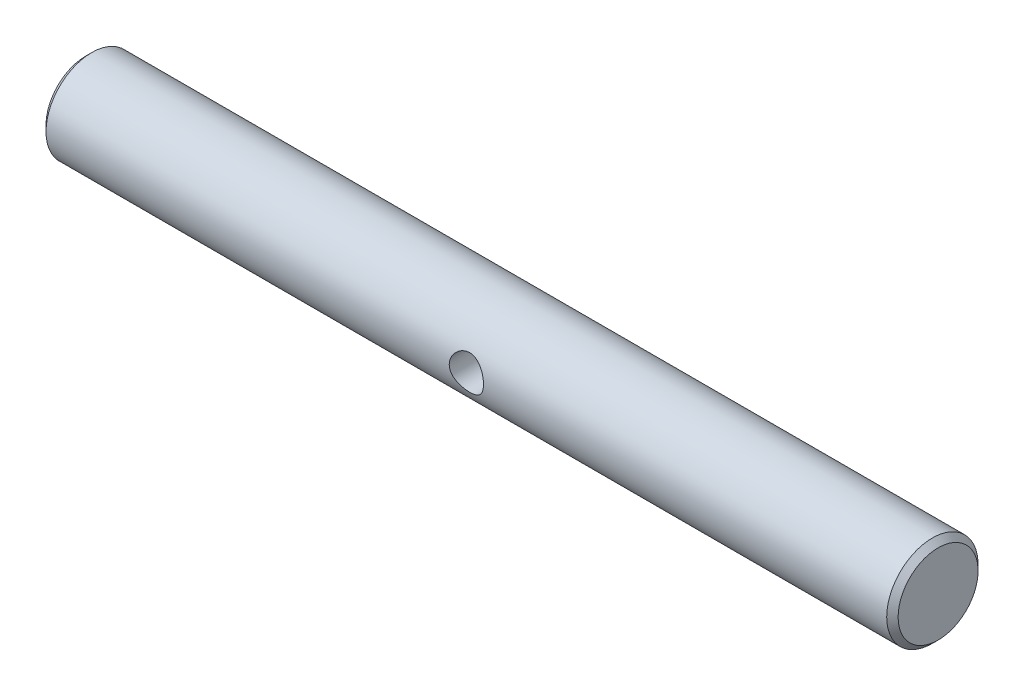
ISO-10303-21;
HEADER;
FILE_DESCRIPTION(('STEP AP214'),'2;1');
FILE_NAME('part.step','',(''),(''),'','','');
FILE_SCHEMA(('AUTOMOTIVE_DESIGN { 1 0 10303 214 1 1 1 1 }'));
ENDSEC;
DATA;
#1=APPLICATION_CONTEXT('core data for automotive mechanical design processes');
#2=APPLICATION_PROTOCOL_DEFINITION('international standard','automotive_design',2000,#1);
#3=PRODUCT_CONTEXT('',#1,'mechanical');
#4=PRODUCT('Part','Part','',(#3));
#5=PRODUCT_RELATED_PRODUCT_CATEGORY('part','',(#4));
#6=PRODUCT_DEFINITION_FORMATION('','',#4);
#7=PRODUCT_DEFINITION_CONTEXT('part definition',#1,'design');
#8=PRODUCT_DEFINITION('design','',#6,#7);
#9=PRODUCT_DEFINITION_SHAPE('','',#8);
#10=(LENGTH_UNIT() NAMED_UNIT(*) SI_UNIT(.MILLI.,.METRE.));
#11=(NAMED_UNIT(*) PLANE_ANGLE_UNIT() SI_UNIT($,.RADIAN.));
#12=(NAMED_UNIT(*) SI_UNIT($,.STERADIAN.) SOLID_ANGLE_UNIT());
#13=UNCERTAINTY_MEASURE_WITH_UNIT(LENGTH_MEASURE(1.E-05),#10,'distance_accuracy_value','');
#14=(GEOMETRIC_REPRESENTATION_CONTEXT(3) GLOBAL_UNCERTAINTY_ASSIGNED_CONTEXT((#13)) GLOBAL_UNIT_ASSIGNED_CONTEXT((#10,
#11,#12)) REPRESENTATION_CONTEXT('',''));
#15=CARTESIAN_POINT('',(0.,0.,0.));
#16=DIRECTION('',(0.,0.,1.));
#17=DIRECTION('',(1.,0.,0.));
#18=AXIS2_PLACEMENT_3D('',#15,#16,#17);
#19=CARTESIAN_POINT('',(37.3,0.,-7.5));
#20=DIRECTION('',(-1.,0.,0.));
#21=DIRECTION('',(0.,0.,1.));
#22=AXIS2_PLACEMENT_3D('',#19,#20,#21);
#23=PLANE('',#22);
#24=CARTESIAN_POINT('',(37.3000000000729,0.,-7.5));
#25=DIRECTION('',(-1.,0.,0.));
#26=DIRECTION('',(0.,0.,1.));
#27=AXIS2_PLACEMENT_3D('',#24,#25,#26);
#28=CIRCLE('',#27,3.50000000003774);
#29=CARTESIAN_POINT('',(37.3000000000729,0.,-3.99999999996226));
#30=VERTEX_POINT('',#29);
#31=EDGE_CURVE('E20',#30,#30,#28,.T.);
#32=ORIENTED_EDGE('',*,*,#31,.F.);
#33=EDGE_LOOP('',(#32));
#34=FACE_BOUND('',#33,.T.);
#35=ADVANCED_FACE('F17',(#34),#23,.F.);
#36=CARTESIAN_POINT('',(-37.3,0.,-7.5));
#37=DIRECTION('',(1.,0.,0.));
#38=DIRECTION('',(0.,0.,-1.));
#39=AXIS2_PLACEMENT_3D('',#36,#37,#38);
#40=PLANE('',#39);
#41=CARTESIAN_POINT('',(-37.3000000000161,0.,-7.5));
#42=DIRECTION('',(1.,0.,0.));
#43=DIRECTION('',(0.,0.,-1.));
#44=AXIS2_PLACEMENT_3D('',#41,#42,#43);
#45=CIRCLE('',#44,3.49999999996726);
#46=CARTESIAN_POINT('',(-37.3000000000161,0.,-10.9999999999673));
#47=VERTEX_POINT('',#46);
#48=EDGE_CURVE('E102',#47,#47,#45,.T.);
#49=ORIENTED_EDGE('',*,*,#48,.F.);
#50=EDGE_LOOP('',(#49));
#51=FACE_BOUND('',#50,.T.);
#52=ADVANCED_FACE('F113',(#51),#40,.F.);
#53=CARTESIAN_POINT('',(36.8000000000279,0.,-7.5));
#54=DIRECTION('',(-1.,0.,0.));
#55=DIRECTION('',(0.,0.,1.));
#56=AXIS2_PLACEMENT_3D('',#53,#54,#55);
#57=CONICAL_SURFACE('',#56,4.00000000002592,0.785398163340605);
#58=ORIENTED_EDGE('',*,*,#31,.T.);
#59=EDGE_LOOP('',(#58));
#60=FACE_BOUND('',#59,.T.);
#61=CARTESIAN_POINT('',(36.8,0.,-7.5));
#62=DIRECTION('',(-1.,0.,0.));
#63=DIRECTION('',(0.,0.,1.));
#64=AXIS2_PLACEMENT_3D('',#61,#62,#63);
#65=CIRCLE('',#64,4.);
#66=CARTESIAN_POINT('',(36.8,0.,-3.5));
#67=VERTEX_POINT('',#66);
#68=EDGE_CURVE('E59',#67,#67,#65,.T.);
#69=ORIENTED_EDGE('',*,*,#68,.F.);
#70=EDGE_LOOP('',(#69));
#71=FACE_BOUND('',#70,.T.);
#72=ADVANCED_FACE('F97',(#60,#71),#57,.T.);
#73=CARTESIAN_POINT('',(0.,0.,19.6475180106472));
#74=DIRECTION('',(0.,0.,-1.));
#75=DIRECTION('',(-1.,0.,0.));
#76=AXIS2_PLACEMENT_3D('',#73,#74,#75);
#77=CYLINDRICAL_SURFACE('',#76,1.5);
#78=CARTESIAN_POINT('',(0.,0.,-11.));
#79=DIRECTION('',(0.,0.,-1.));
#80=DIRECTION('',(-1.,0.,0.));
#81=AXIS2_PLACEMENT_3D('',#78,#79,#80);
#82=CIRCLE('',#81,1.5);
#83=CARTESIAN_POINT('',(-1.5,0.,-11.));
#84=VERTEX_POINT('',#83);
#85=EDGE_CURVE('E54',#84,#84,#82,.T.);
#86=ORIENTED_EDGE('',*,*,#85,.T.);
#87=EDGE_LOOP('',(#86));
#88=FACE_BOUND('',#87,.T.);
#89=CARTESIAN_POINT('',(1.5,0.,-3.5));
#90=CARTESIAN_POINT('',(1.49999531099465,-0.0811116429884713,-3.50000358485876));
#91=CARTESIAN_POINT('',(1.49338938745138,-0.16229921963897,-3.50249349886293));
#92=CARTESIAN_POINT('',(1.46720660039424,-0.322336155858779,-3.51219945479501));
#93=CARTESIAN_POINT('',(1.44760993379607,-0.401181753294325,-3.51942271203636));
#94=CARTESIAN_POINT('',(1.39624231347491,-0.554069232231289,-3.5378135631584));
#95=CARTESIAN_POINT('',(1.36450309579201,-0.628123052651569,-3.54897086901631));
#96=CARTESIAN_POINT('',(1.28987991906231,-0.769822157276449,-3.57411671625291));
#97=CARTESIAN_POINT('',(1.24699654962911,-0.837467780266993,-3.58810510783615));
#98=CARTESIAN_POINT('',(1.14938858838142,-0.96734457210255,-3.61813720475945));
#99=CARTESIAN_POINT('',(1.09427228489637,-1.02926777687364,-3.63423923528697));
#100=CARTESIAN_POINT('',(0.974592564626967,-1.14324188632408,-3.66639703981789));
#101=CARTESIAN_POINT('',(0.910025832054865,-1.19528931119753,-3.68245279556083));
#102=CARTESIAN_POINT('',(0.770282478567812,-1.28998203402363,-3.71337530747852));
#103=CARTESIAN_POINT('',(0.694795528037964,-1.33219398439963,-3.72817353294826));
#104=CARTESIAN_POINT('',(0.537151533998551,-1.40318650874601,-3.75400141217516));
#105=CARTESIAN_POINT('',(0.454997179300717,-1.43197246582411,-3.76503257584738));
#106=CARTESIAN_POINT('',(0.289883223820329,-1.4740843178649,-3.78145587544433));
#107=CARTESIAN_POINT('',(0.207094888296945,-1.48799594439153,-3.78706076144318));
#108=CARTESIAN_POINT('',(0.0401837675610274,-1.50179556532977,-3.79261938536036));
#109=CARTESIAN_POINT('',(-0.0439384509453212,-1.50168936368421,-3.79257546211238));
#110=CARTESIAN_POINT('',(-0.205769379258228,-1.48790430964632,-3.78702488870721));
#111=CARTESIAN_POINT('',(-0.283560616182979,-1.47503813739896,-3.7818453306637));
#112=CARTESIAN_POINT('',(-0.435786872782353,-1.43744176653922,-3.76715065494345));
#113=CARTESIAN_POINT('',(-0.510221372622172,-1.4127097371985,-3.75763486826138));
#114=CARTESIAN_POINT('',(-0.655278746807224,-1.35163679493086,-3.73514271726201));
#115=CARTESIAN_POINT('',(-0.725802721117845,-1.31508487135368,-3.72210422013274));
#116=CARTESIAN_POINT('',(-0.85994867252144,-1.23155851162953,-3.69405720835926));
#117=CARTESIAN_POINT('',(-0.923568573944546,-1.18458095393025,-3.67904810424394));
#118=CARTESIAN_POINT('',(-1.04659388295345,-1.07782653131746,-3.6475221106674));
#119=CARTESIAN_POINT('',(-1.10543046100101,-1.01740255191559,-3.63097160984375));
#120=CARTESIAN_POINT('',(-1.21232323409957,-0.887333075094535,-3.5990874515603));
#121=CARTESIAN_POINT('',(-1.26037445221371,-0.817683343900649,-3.58375435797721));
#122=CARTESIAN_POINT('',(-1.34496404362537,-0.669667722666033,-3.55572478356694));
#123=CARTESIAN_POINT('',(-1.38130440400476,-0.591179456886812,-3.54307477481692));
#124=CARTESIAN_POINT('',(-1.44001960464153,-0.428688642380452,-3.52219969655296));
#125=CARTESIAN_POINT('',(-1.46242269657435,-0.344697632799011,-3.51396568026522));
#126=CARTESIAN_POINT('',(-1.48491866803032,-0.216582758497681,-3.50563607419094));
#127=CARTESIAN_POINT('',(-1.49056593106552,-0.173494852533975,-3.50352971738935));
#128=CARTESIAN_POINT('',(-1.49810784826254,-0.0869452380128497,-3.50071072148523));
#129=CARTESIAN_POINT('',(-1.50000251375142,-0.0434835305841315,-3.49999807817584));
#130=CARTESIAN_POINT('',(-1.49999531099465,0.0811116429884706,-3.50000358485876));
#131=CARTESIAN_POINT('',(-1.49338938745138,0.162299219638969,-3.50249349886293));
#132=CARTESIAN_POINT('',(-1.46720660039424,0.322336155858778,-3.51219945479501));
#133=CARTESIAN_POINT('',(-1.44760993379608,0.401181753294325,-3.51942271203636));
#134=CARTESIAN_POINT('',(-1.39624231347491,0.554069232231288,-3.5378135631584));
#135=CARTESIAN_POINT('',(-1.36450309579201,0.628123052651568,-3.54897086901631));
#136=CARTESIAN_POINT('',(-1.28987991906231,0.769822157276448,-3.57411671625291));
#137=CARTESIAN_POINT('',(-1.24699654962911,0.837467780266992,-3.58810510783615));
#138=CARTESIAN_POINT('',(-1.14938858838142,0.967344572102549,-3.61813720475945));
#139=CARTESIAN_POINT('',(-1.09427228489637,1.02926777687364,-3.63423923528697));
#140=CARTESIAN_POINT('',(-0.974592564626968,1.14324188632408,-3.66639703981789));
#141=CARTESIAN_POINT('',(-0.910025832054866,1.19528931119753,-3.68245279556083));
#142=CARTESIAN_POINT('',(-0.770282478567812,1.28998203402363,-3.71337530747852));
#143=CARTESIAN_POINT('',(-0.694795528037964,1.33219398439963,-3.72817353294826));
#144=CARTESIAN_POINT('',(-0.537151533998552,1.40318650874601,-3.75400141217516));
#145=CARTESIAN_POINT('',(-0.454997179300718,1.43197246582411,-3.76503257584738));
#146=CARTESIAN_POINT('',(-0.28988322382033,1.4740843178649,-3.78145587544433));
#147=CARTESIAN_POINT('',(-0.207094888296946,1.48799594439153,-3.78706076144318));
#148=CARTESIAN_POINT('',(-0.0401837675610278,1.50179556532977,-3.79261938536036));
#149=CARTESIAN_POINT('',(0.0439384509453204,1.50168936368421,-3.79257546211238));
#150=CARTESIAN_POINT('',(0.205769379258227,1.48790430964632,-3.78702488870721));
#151=CARTESIAN_POINT('',(0.283560616182978,1.47503813739896,-3.7818453306637));
#152=CARTESIAN_POINT('',(0.435786872782352,1.43744176653922,-3.76715065494345));
#153=CARTESIAN_POINT('',(0.510221372622171,1.4127097371985,-3.75763486826138));
#154=CARTESIAN_POINT('',(0.655278746807223,1.35163679493086,-3.73514271726201));
#155=CARTESIAN_POINT('',(0.725802721117844,1.31508487135368,-3.72210422013274));
#156=CARTESIAN_POINT('',(0.859948672521439,1.23155851162953,-3.69405720835926));
#157=CARTESIAN_POINT('',(0.923568573944546,1.18458095393025,-3.67904810424394));
#158=CARTESIAN_POINT('',(1.04659388295345,1.07782653131746,-3.6475221106674));
#159=CARTESIAN_POINT('',(1.10543046100101,1.01740255191559,-3.63097160984375));
#160=CARTESIAN_POINT('',(1.21232323409956,0.887333075094535,-3.5990874515603));
#161=CARTESIAN_POINT('',(1.26037445221371,0.81768334390065,-3.58375435797721));
#162=CARTESIAN_POINT('',(1.34496404362537,0.669667722666034,-3.55572478356694));
#163=CARTESIAN_POINT('',(1.38130440400476,0.591179456886812,-3.54307477481692));
#164=CARTESIAN_POINT('',(1.44001960464153,0.428688642380452,-3.52219969655296));
#165=CARTESIAN_POINT('',(1.46242269657434,0.344697632799011,-3.51396568026522));
#166=CARTESIAN_POINT('',(1.48491866803032,0.216582758497681,-3.50563607419094));
#167=CARTESIAN_POINT('',(1.49056593106552,0.173494852533975,-3.50352971738935));
#168=CARTESIAN_POINT('',(1.49810784826254,0.086945238012849,-3.50071072148523));
#169=CARTESIAN_POINT('',(1.50000251375142,0.0434835305841308,-3.49999807817584));
#170=CARTESIAN_POINT('',(1.5,0.,-3.5));
#171=B_SPLINE_CURVE_WITH_KNOTS('',3,(#89,#90,#91,#92,#93,#94,#95,#96,#97,#98,#99,#100,#101,#102,
#103,#104,#105,#106,#107,#108,#109,#110,#111,#112,#113,#114,#115,#116,#117,#118,#119,#120,#121,
#122,#123,#124,#125,#126,#127,#128,#129,#130,#131,#132,#133,#134,#135,#136,#137,#138,#139,#140,
#141,#142,#143,#144,#145,#146,#147,#148,#149,#150,#151,#152,#153,#154,#155,#156,#157,#158,#159,
#160,#161,#162,#163,#164,#165,#166,#167,#168,#169,#170),.UNSPECIFIED.,.T.,.F.,(4,2,2,2,2,2,2,2,
2,2,2,2,2,2,2,2,2,2,2,2,2,2,2,2,2,2,2,2,2,2,2,2,2,2,2,2,2,2,2,2,4),(0.,0.243166514302296,
0.486704566599218,0.729610403544444,0.97250339146879,1.22473037141675,1.47704606108122,
1.73896693662271,2.00078270538428,2.25185886666104,2.50283107266743,2.73878302477871,
2.97477139254032,3.21522960902626,3.45575991877768,3.71242215551977,3.96920258743901,
4.23012113132895,4.49050903953852,4.62086973855367,4.75123004407976,4.99439655838206,
5.23793461067898,5.48084044762421,5.72373343554855,5.97596041549652,6.22827610516099,
6.49019698070247,6.75201274946405,7.0030889107408,7.25406111674719,7.49001306885847,
7.72600143662008,7.96645965310602,8.20698996285745,8.46365219959954,8.72043263151877,
8.98135117540872,9.24173908361828,9.37209978263343,9.50246008815953),.UNSPECIFIED.);
#172=CARTESIAN_POINT('',(1.5,0.,-3.5));
#173=VERTEX_POINT('',#172);
#174=EDGE_CURVE('E65',#173,#173,#171,.T.);
#175=ORIENTED_EDGE('',*,*,#174,.F.);
#176=EDGE_LOOP('',(#175));
#177=FACE_BOUND('',#176,.T.);
#178=ADVANCED_FACE('F75',(#88,#177),#77,.F.);
#179=CARTESIAN_POINT('',(-36.8000000000279,0.,-7.5));
#180=DIRECTION('',(1.,0.,0.));
#181=DIRECTION('',(0.,0.,-1.));
#182=AXIS2_PLACEMENT_3D('',#179,#180,#181);
#183=CONICAL_SURFACE('',#182,3.99999999995544,0.785398163397448);
#184=ORIENTED_EDGE('',*,*,#48,.T.);
#185=EDGE_LOOP('',(#184));
#186=FACE_BOUND('',#185,.T.);
#187=CARTESIAN_POINT('',(-36.8,0.,-7.5));
#188=DIRECTION('',(-1.,0.,0.));
#189=DIRECTION('',(0.,0.,1.));
#190=AXIS2_PLACEMENT_3D('',#187,#188,#189);
#191=CIRCLE('',#190,4.);
#192=CARTESIAN_POINT('',(-36.8,0.,-3.5));
#193=VERTEX_POINT('',#192);
#194=EDGE_CURVE('E50',#193,#193,#191,.F.);
#195=ORIENTED_EDGE('',*,*,#194,.F.);
#196=EDGE_LOOP('',(#195));
#197=FACE_BOUND('',#196,.T.);
#198=ADVANCED_FACE('F90',(#186,#197),#183,.T.);
#199=CARTESIAN_POINT('',(-22.3497393521028,10.,-23.));
#200=DIRECTION('',(-0.965925826289069,-0.258819045102518,0.));
#201=DIRECTION('',(0.258819045102518,-0.965925826289069,0.));
#202=AXIS2_PLACEMENT_3D('',#199,#200,#201);
#203=PLANE('',#202);
#204=DIRECTION('',(0.258819045102517,-0.965925826289069,0.));
#205=VECTOR('',#204,1.);
#206=CARTESIAN_POINT('',(-20.1891288077493,1.9364916731037,-11.));
#207=LINE('',#206,#205);
#208=CARTESIAN_POINT('',(-20.1891288077493,1.93649167310371,-11.));
#209=VERTEX_POINT('',#208);
#210=CARTESIAN_POINT('',(-19.1513660478338,-1.93649167310371,-11.));
#211=VERTEX_POINT('',#210);
#212=EDGE_CURVE('E49',#209,#211,#207,.T.);
#213=ORIENTED_EDGE('',*,*,#212,.T.);
#214=CARTESIAN_POINT('',(-19.6702474277916,0.,-7.5));
#215=DIRECTION('',(-0.965925826289069,-0.258819045102518,0.));
#216=DIRECTION('',(-0.258819045102518,0.965925826289069,0.));
#217=AXIS2_PLACEMENT_3D('',#214,#215,#216);
#218=ELLIPSE('',#217,4.14110472164033,4.);
#219=EDGE_CURVE('E46',#209,#211,#218,.T.);
#220=ORIENTED_EDGE('',*,*,#219,.F.);
#221=EDGE_LOOP('',(#213,#220));
#222=FACE_BOUND('',#221,.T.);
#223=ADVANCED_FACE('F47',(#222),#203,.F.);
#224=CARTESIAN_POINT('',(0.,0.,-11.));
#225=DIRECTION('',(0.,0.,1.));
#226=DIRECTION('',(1.,0.,0.));
#227=AXIS2_PLACEMENT_3D('',#224,#225,#226);
#228=PLANE('',#227);
#229=ORIENTED_EDGE('',*,*,#212,.F.);
#230=DIRECTION('',(1.,0.,0.));
#231=VECTOR('',#230,1.);
#232=CARTESIAN_POINT('',(0.,1.93649167310371,-11.));
#233=LINE('',#232,#231);
#234=CARTESIAN_POINT('',(20.1891288077493,1.93649167310372,-11.));
#235=VERTEX_POINT('',#234);
#236=EDGE_CURVE('E52',#235,#209,#233,.F.);
#237=ORIENTED_EDGE('',*,*,#236,.F.);
#238=DIRECTION('',(-0.258819045102518,-0.965925826289069,0.));
#239=VECTOR('',#238,1.);
#240=CARTESIAN_POINT('',(22.3497393521028,10.,-11.));
#241=LINE('',#240,#239);
#242=CARTESIAN_POINT('',(19.1513660478338,-1.93649167310371,-11.));
#243=VERTEX_POINT('',#242);
#244=EDGE_CURVE('E35',#243,#235,#241,.F.);
#245=ORIENTED_EDGE('',*,*,#244,.F.);
#246=DIRECTION('',(-1.,0.,0.));
#247=VECTOR('',#246,1.);
#248=CARTESIAN_POINT('',(37.3,-1.93649167310371,-11.));
#249=LINE('',#248,#247);
#250=EDGE_CURVE('E26',#211,#243,#249,.F.);
#251=ORIENTED_EDGE('',*,*,#250,.F.);
#252=EDGE_LOOP('',(#229,#237,#245,#251));
#253=FACE_BOUND('',#252,.T.);
#254=ORIENTED_EDGE('',*,*,#85,.F.);
#255=EDGE_LOOP('',(#254));
#256=FACE_BOUND('',#255,.T.);
#257=ADVANCED_FACE('F56',(#253,#256),#228,.F.);
#258=CARTESIAN_POINT('',(22.3497393521028,10.,-23.));
#259=DIRECTION('',(-0.965925826289069,0.258819045102518,0.));
#260=DIRECTION('',(-0.258819045102518,-0.965925826289069,0.));
#261=AXIS2_PLACEMENT_3D('',#258,#259,#260);
#262=PLANE('',#261);
#263=ORIENTED_EDGE('',*,*,#244,.T.);
#264=CARTESIAN_POINT('',(19.6702474277916,0.,-7.5));
#265=DIRECTION('',(-0.965925826289069,0.258819045102518,0.));
#266=DIRECTION('',(-0.258819045102518,-0.965925826289069,0.));
#267=AXIS2_PLACEMENT_3D('',#264,#265,#266);
#268=ELLIPSE('',#267,4.14110472164033,4.);
#269=EDGE_CURVE('E11',#243,#235,#268,.F.);
#270=ORIENTED_EDGE('',*,*,#269,.F.);
#271=EDGE_LOOP('',(#263,#270));
#272=FACE_BOUND('',#271,.T.);
#273=ADVANCED_FACE('F82',(#272),#262,.T.);
#274=CARTESIAN_POINT('',(37.3,0.,-7.5));
#275=DIRECTION('',(-1.,0.,0.));
#276=DIRECTION('',(0.,0.,1.));
#277=AXIS2_PLACEMENT_3D('',#274,#275,#276);
#278=CYLINDRICAL_SURFACE('',#277,4.);
#279=ORIENTED_EDGE('',*,*,#68,.T.);
#280=EDGE_LOOP('',(#279));
#281=FACE_BOUND('',#280,.T.);
#282=ORIENTED_EDGE('',*,*,#174,.T.);
#283=EDGE_LOOP('',(#282));
#284=FACE_BOUND('',#283,.T.);
#285=ORIENTED_EDGE('',*,*,#194,.T.);
#286=EDGE_LOOP('',(#285));
#287=FACE_BOUND('',#286,.T.);
#288=ORIENTED_EDGE('',*,*,#250,.T.);
#289=ORIENTED_EDGE('',*,*,#269,.T.);
#290=ORIENTED_EDGE('',*,*,#236,.T.);
#291=ORIENTED_EDGE('',*,*,#219,.T.);
#292=EDGE_LOOP('',(#288,#289,#290,#291));
#293=FACE_BOUND('',#292,.T.);
#294=ADVANCED_FACE('F53',(#281,#284,#287,#293),#278,.T.);
#295=CLOSED_SHELL('',(#35,#52,#72,#178,#198,#223,#257,#273,#294));
#296=MANIFOLD_SOLID_BREP('B1',#295);
#297=ADVANCED_BREP_SHAPE_REPRESENTATION('',(#18,#296),#14);
#298=SHAPE_DEFINITION_REPRESENTATION(#9,#297);
ENDSEC;
END-ISO-10303-21;
